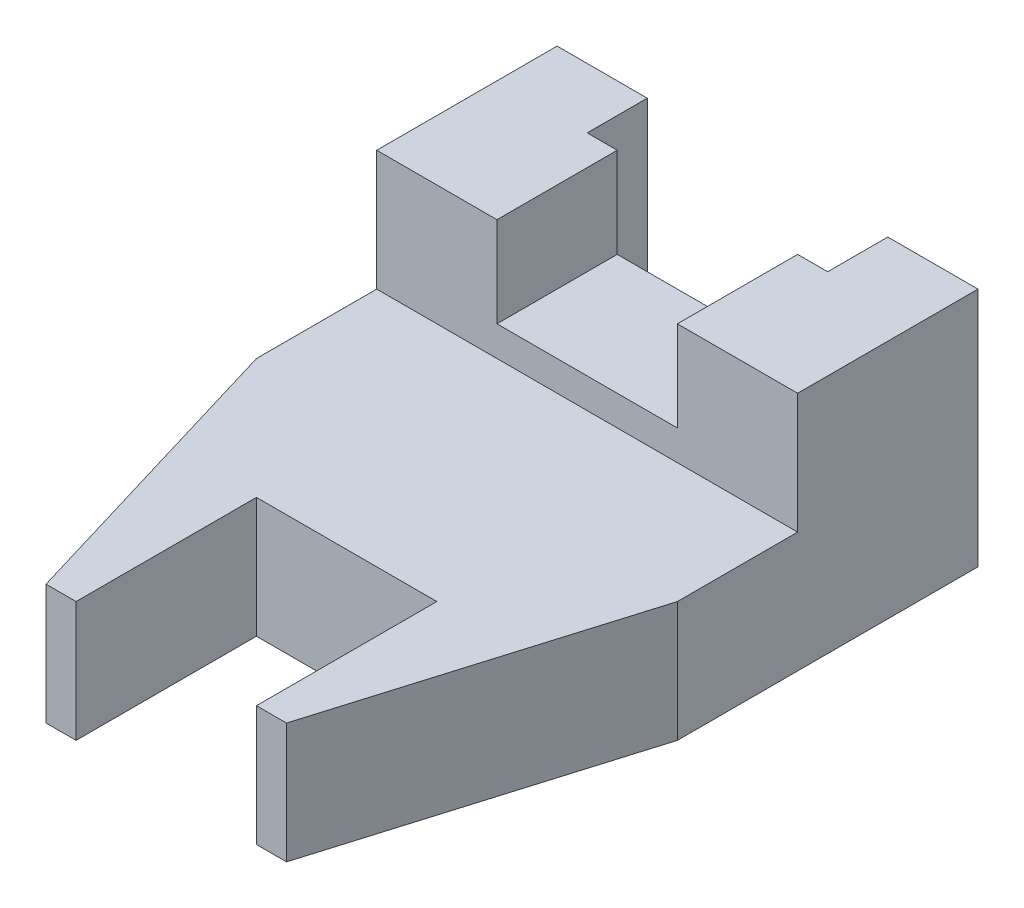
ISO-10303-21;
HEADER;
FILE_DESCRIPTION(('STEP AP214'),'2;1');
FILE_NAME('part.step','',(''),(''),'','','');
FILE_SCHEMA(('AUTOMOTIVE_DESIGN { 1 0 10303 214 1 1 1 1 }'));
ENDSEC;
DATA;
#1=APPLICATION_CONTEXT('core data for automotive mechanical design processes');
#2=APPLICATION_PROTOCOL_DEFINITION('international standard','automotive_design',2000,#1);
#3=PRODUCT_CONTEXT('',#1,'mechanical');
#4=PRODUCT('Part','Part','',(#3));
#5=PRODUCT_RELATED_PRODUCT_CATEGORY('part','',(#4));
#6=PRODUCT_DEFINITION_FORMATION('','',#4);
#7=PRODUCT_DEFINITION_CONTEXT('part definition',#1,'design');
#8=PRODUCT_DEFINITION('design','',#6,#7);
#9=PRODUCT_DEFINITION_SHAPE('','',#8);
#10=(LENGTH_UNIT() NAMED_UNIT(*) SI_UNIT(.MILLI.,.METRE.));
#11=(NAMED_UNIT(*) PLANE_ANGLE_UNIT() SI_UNIT($,.RADIAN.));
#12=(NAMED_UNIT(*) SI_UNIT($,.STERADIAN.) SOLID_ANGLE_UNIT());
#13=UNCERTAINTY_MEASURE_WITH_UNIT(LENGTH_MEASURE(1.E-05),#10,'distance_accuracy_value','');
#14=(GEOMETRIC_REPRESENTATION_CONTEXT(3) GLOBAL_UNCERTAINTY_ASSIGNED_CONTEXT((#13)) GLOBAL_UNIT_ASSIGNED_CONTEXT((#10,
#11,#12)) REPRESENTATION_CONTEXT('',''));
#15=CARTESIAN_POINT('',(0.,0.,0.));
#16=DIRECTION('',(0.,0.,1.));
#17=DIRECTION('',(1.,0.,0.));
#18=AXIS2_PLACEMENT_3D('',#15,#16,#17);
#19=CARTESIAN_POINT('',(0.,40.,0.));
#20=DIRECTION('',(0.,-1.,0.));
#21=DIRECTION('',(0.,0.,-1.));
#22=AXIS2_PLACEMENT_3D('',#19,#20,#21);
#23=PLANE('',#22);
#24=DIRECTION('',(1.,0.,0.));
#25=VECTOR('',#24,1.);
#26=CARTESIAN_POINT('',(15.,40.,-40.));
#27=LINE('',#26,#25);
#28=CARTESIAN_POINT('',(50.,40.,-40.));
#29=VERTEX_POINT('',#28);
#30=CARTESIAN_POINT('',(55.,40.,-40.));
#31=VERTEX_POINT('',#30);
#32=EDGE_CURVE('E198',#29,#31,#27,.T.);
#33=ORIENTED_EDGE('',*,*,#32,.F.);
#34=DIRECTION('',(0.,0.,1.));
#35=VECTOR('',#34,1.);
#36=CARTESIAN_POINT('',(50.,40.,-50.001));
#37=LINE('',#36,#35);
#38=CARTESIAN_POINT('',(50.,40.,-20.));
#39=VERTEX_POINT('',#38);
#40=EDGE_CURVE('E183',#29,#39,#37,.T.);
#41=ORIENTED_EDGE('',*,*,#40,.T.);
#42=DIRECTION('',(1.,0.,0.));
#43=VECTOR('',#42,1.);
#44=CARTESIAN_POINT('',(0.,40.,-20.));
#45=LINE('',#44,#43);
#46=CARTESIAN_POINT('',(70.,40.,-20.));
#47=VERTEX_POINT('',#46);
#48=EDGE_CURVE('E218',#39,#47,#45,.T.);
#49=ORIENTED_EDGE('',*,*,#48,.T.);
#50=DIRECTION('',(0.,0.,-1.));
#51=VECTOR('',#50,1.);
#52=CARTESIAN_POINT('',(70.,40.,-50.));
#53=LINE('',#52,#51);
#54=CARTESIAN_POINT('',(70.,40.,-50.));
#55=VERTEX_POINT('',#54);
#56=EDGE_CURVE('E220',#47,#55,#53,.T.);
#57=ORIENTED_EDGE('',*,*,#56,.T.);
#58=DIRECTION('',(-1.,0.,0.));
#59=VECTOR('',#58,1.);
#60=CARTESIAN_POINT('',(0.,40.,-50.));
#61=LINE('',#60,#59);
#62=CARTESIAN_POINT('',(55.,40.,-50.));
#63=VERTEX_POINT('',#62);
#64=EDGE_CURVE('E224',#55,#63,#61,.T.);
#65=ORIENTED_EDGE('',*,*,#64,.T.);
#66=DIRECTION('',(0.,0.,-1.));
#67=VECTOR('',#66,1.);
#68=CARTESIAN_POINT('',(55.,40.,-40.));
#69=LINE('',#68,#67);
#70=EDGE_CURVE('E197',#31,#63,#69,.T.);
#71=ORIENTED_EDGE('',*,*,#70,.F.);
#72=EDGE_LOOP('',(#33,#41,#49,#57,#65,#71));
#73=FACE_BOUND('',#72,.T.);
#74=ADVANCED_FACE('F37',(#73),#23,.F.);
#75=CARTESIAN_POINT('',(0.,20.,-50.));
#76=DIRECTION('',(0.,0.,1.));
#77=DIRECTION('',(1.,0.,0.));
#78=AXIS2_PLACEMENT_3D('',#75,#76,#77);
#79=PLANE('',#78);
#80=CARTESIAN_POINT('',(15.,40.,-50.));
#81=VERTEX_POINT('',#80);
#82=CARTESIAN_POINT('',(0.,40.,-50.));
#83=VERTEX_POINT('',#82);
#84=EDGE_CURVE('E223',#81,#83,#61,.T.);
#85=ORIENTED_EDGE('',*,*,#84,.F.);
#86=DIRECTION('',(0.,1.,0.));
#87=VECTOR('',#86,1.);
#88=CARTESIAN_POINT('',(15.,-0.001000000000001,-50.));
#89=LINE('',#88,#87);
#90=CARTESIAN_POINT('',(15.,0.,-50.));
#91=VERTEX_POINT('',#90);
#92=EDGE_CURVE('E204',#91,#81,#89,.T.);
#93=ORIENTED_EDGE('',*,*,#92,.F.);
#94=DIRECTION('',(-1.,0.,0.));
#95=VECTOR('',#94,1.);
#96=CARTESIAN_POINT('',(0.,0.,-50.));
#97=LINE('',#96,#95);
#98=CARTESIAN_POINT('',(0.,0.,-50.));
#99=VERTEX_POINT('',#98);
#100=EDGE_CURVE('E273',#91,#99,#97,.T.);
#101=ORIENTED_EDGE('',*,*,#100,.T.);
#102=DIRECTION('',(0.,-1.,0.));
#103=VECTOR('',#102,1.);
#104=CARTESIAN_POINT('',(0.,20.,-50.));
#105=LINE('',#104,#103);
#106=EDGE_CURVE('E280',#83,#99,#105,.T.);
#107=ORIENTED_EDGE('',*,*,#106,.F.);
#108=EDGE_LOOP('',(#85,#93,#101,#107));
#109=FACE_BOUND('',#108,.T.);
#110=ADVANCED_FACE('F342',(#109),#79,.F.);
#111=CARTESIAN_POINT('',(0.,20.,0.));
#112=DIRECTION('',(0.957826285221151,0.,-0.287347885566346));
#113=DIRECTION('',(-0.287347885566346,0.,-0.957826285221151));
#114=AXIS2_PLACEMENT_3D('',#111,#112,#113);
#115=PLANE('',#114);
#116=DIRECTION('',(0.287347885566346,0.,0.957826285221151));
#117=VECTOR('',#116,1.);
#118=CARTESIAN_POINT('',(0.,0.,0.));
#119=LINE('',#118,#117);
#120=CARTESIAN_POINT('',(0.,0.,0.));
#121=VERTEX_POINT('',#120);
#122=CARTESIAN_POINT('',(15.,0.,50.));
#123=VERTEX_POINT('',#122);
#124=EDGE_CURVE('E235',#121,#123,#119,.T.);
#125=ORIENTED_EDGE('',*,*,#124,.T.);
#126=DIRECTION('',(0.,-1.,0.));
#127=VECTOR('',#126,1.);
#128=CARTESIAN_POINT('',(15.,20.,50.));
#129=LINE('',#128,#127);
#130=CARTESIAN_POINT('',(15.,20.,50.));
#131=VERTEX_POINT('',#130);
#132=EDGE_CURVE('E11',#131,#123,#129,.T.);
#133=ORIENTED_EDGE('',*,*,#132,.F.);
#134=DIRECTION('',(0.287347885566346,0.,0.957826285221151));
#135=VECTOR('',#134,1.);
#136=CARTESIAN_POINT('',(0.,20.,0.));
#137=LINE('',#136,#135);
#138=CARTESIAN_POINT('',(0.,20.,0.));
#139=VERTEX_POINT('',#138);
#140=EDGE_CURVE('E236',#139,#131,#137,.T.);
#141=ORIENTED_EDGE('',*,*,#140,.F.);
#142=DIRECTION('',(0.,-1.,0.));
#143=VECTOR('',#142,1.);
#144=CARTESIAN_POINT('',(0.,20.,0.));
#145=LINE('',#144,#143);
#146=EDGE_CURVE('E256',#139,#121,#145,.T.);
#147=ORIENTED_EDGE('',*,*,#146,.T.);
#148=EDGE_LOOP('',(#125,#133,#141,#147));
#149=FACE_BOUND('',#148,.T.);
#150=ADVANCED_FACE('F39',(#149),#115,.F.);
#151=CARTESIAN_POINT('',(15.,20.,50.));
#152=DIRECTION('',(0.,0.,-1.));
#153=DIRECTION('',(-1.,0.,0.));
#154=AXIS2_PLACEMENT_3D('',#151,#152,#153);
#155=PLANE('',#154);
#156=DIRECTION('',(1.,0.,0.));
#157=VECTOR('',#156,1.);
#158=CARTESIAN_POINT('',(15.,0.,50.));
#159=LINE('',#158,#157);
#160=CARTESIAN_POINT('',(20.,0.,50.));
#161=VERTEX_POINT('',#160);
#162=EDGE_CURVE('E259',#123,#161,#159,.T.);
#163=ORIENTED_EDGE('',*,*,#162,.T.);
#164=DIRECTION('',(0.,-1.,0.));
#165=VECTOR('',#164,1.);
#166=CARTESIAN_POINT('',(20.,20.,50.));
#167=LINE('',#166,#165);
#168=CARTESIAN_POINT('',(20.,20.,50.));
#169=VERTEX_POINT('',#168);
#170=EDGE_CURVE('E45',#169,#161,#167,.T.);
#171=ORIENTED_EDGE('',*,*,#170,.F.);
#172=DIRECTION('',(1.,0.,0.));
#173=VECTOR('',#172,1.);
#174=CARTESIAN_POINT('',(15.,20.,50.));
#175=LINE('',#174,#173);
#176=EDGE_CURVE('E239',#131,#169,#175,.T.);
#177=ORIENTED_EDGE('',*,*,#176,.F.);
#178=ORIENTED_EDGE('',*,*,#132,.T.);
#179=EDGE_LOOP('',(#163,#171,#177,#178));
#180=FACE_BOUND('',#179,.T.);
#181=ADVANCED_FACE('F329',(#180),#155,.F.);
#182=CARTESIAN_POINT('',(20.,20.,50.));
#183=DIRECTION('',(-1.,0.,0.));
#184=DIRECTION('',(0.,0.,1.));
#185=AXIS2_PLACEMENT_3D('',#182,#183,#184);
#186=PLANE('',#185);
#187=DIRECTION('',(0.,0.,-1.));
#188=VECTOR('',#187,1.);
#189=CARTESIAN_POINT('',(20.,0.,50.));
#190=LINE('',#189,#188);
#191=CARTESIAN_POINT('',(20.,0.,20.));
#192=VERTEX_POINT('',#191);
#193=EDGE_CURVE('E261',#161,#192,#190,.T.);
#194=ORIENTED_EDGE('',*,*,#193,.T.);
#195=DIRECTION('',(0.,-1.,0.));
#196=VECTOR('',#195,1.);
#197=CARTESIAN_POINT('',(20.,20.,20.));
#198=LINE('',#197,#196);
#199=CARTESIAN_POINT('',(20.,20.,20.));
#200=VERTEX_POINT('',#199);
#201=EDGE_CURVE('E298',#200,#192,#198,.T.);
#202=ORIENTED_EDGE('',*,*,#201,.F.);
#203=DIRECTION('',(0.,0.,-1.));
#204=VECTOR('',#203,1.);
#205=CARTESIAN_POINT('',(20.,20.,50.));
#206=LINE('',#205,#204);
#207=EDGE_CURVE('E242',#169,#200,#206,.T.);
#208=ORIENTED_EDGE('',*,*,#207,.F.);
#209=ORIENTED_EDGE('',*,*,#170,.T.);
#210=EDGE_LOOP('',(#194,#202,#208,#209));
#211=FACE_BOUND('',#210,.T.);
#212=ADVANCED_FACE('F305',(#211),#186,.F.);
#213=CARTESIAN_POINT('',(20.,20.,20.));
#214=DIRECTION('',(0.,0.,-1.));
#215=DIRECTION('',(-1.,0.,0.));
#216=AXIS2_PLACEMENT_3D('',#213,#214,#215);
#217=PLANE('',#216);
#218=DIRECTION('',(1.,0.,0.));
#219=VECTOR('',#218,1.);
#220=CARTESIAN_POINT('',(20.,0.,20.));
#221=LINE('',#220,#219);
#222=CARTESIAN_POINT('',(50.,0.,20.));
#223=VERTEX_POINT('',#222);
#224=EDGE_CURVE('E263',#192,#223,#221,.T.);
#225=ORIENTED_EDGE('',*,*,#224,.T.);
#226=DIRECTION('',(0.,-1.,0.));
#227=VECTOR('',#226,1.);
#228=CARTESIAN_POINT('',(50.,20.,20.));
#229=LINE('',#228,#227);
#230=CARTESIAN_POINT('',(50.,20.,20.));
#231=VERTEX_POINT('',#230);
#232=EDGE_CURVE('E295',#231,#223,#229,.T.);
#233=ORIENTED_EDGE('',*,*,#232,.F.);
#234=DIRECTION('',(1.,0.,0.));
#235=VECTOR('',#234,1.);
#236=CARTESIAN_POINT('',(20.,20.,20.));
#237=LINE('',#236,#235);
#238=EDGE_CURVE('E244',#200,#231,#237,.T.);
#239=ORIENTED_EDGE('',*,*,#238,.F.);
#240=ORIENTED_EDGE('',*,*,#201,.T.);
#241=EDGE_LOOP('',(#225,#233,#239,#240));
#242=FACE_BOUND('',#241,.T.);
#243=ADVANCED_FACE('F317',(#242),#217,.F.);
#244=CARTESIAN_POINT('',(50.,20.,20.));
#245=DIRECTION('',(1.,0.,0.));
#246=DIRECTION('',(0.,0.,-1.));
#247=AXIS2_PLACEMENT_3D('',#244,#245,#246);
#248=PLANE('',#247);
#249=DIRECTION('',(0.,0.,1.));
#250=VECTOR('',#249,1.);
#251=CARTESIAN_POINT('',(50.,0.,20.));
#252=LINE('',#251,#250);
#253=CARTESIAN_POINT('',(50.,0.,50.));
#254=VERTEX_POINT('',#253);
#255=EDGE_CURVE('E265',#223,#254,#252,.T.);
#256=ORIENTED_EDGE('',*,*,#255,.T.);
#257=DIRECTION('',(0.,-1.,0.));
#258=VECTOR('',#257,1.);
#259=CARTESIAN_POINT('',(50.,20.,50.));
#260=LINE('',#259,#258);
#261=CARTESIAN_POINT('',(50.,20.,50.));
#262=VERTEX_POINT('',#261);
#263=EDGE_CURVE('E292',#262,#254,#260,.T.);
#264=ORIENTED_EDGE('',*,*,#263,.F.);
#265=DIRECTION('',(0.,0.,1.));
#266=VECTOR('',#265,1.);
#267=CARTESIAN_POINT('',(50.,20.,20.));
#268=LINE('',#267,#266);
#269=EDGE_CURVE('E246',#231,#262,#268,.T.);
#270=ORIENTED_EDGE('',*,*,#269,.F.);
#271=ORIENTED_EDGE('',*,*,#232,.T.);
#272=EDGE_LOOP('',(#256,#264,#270,#271));
#273=FACE_BOUND('',#272,.T.);
#274=ADVANCED_FACE('F321',(#273),#248,.F.);
#275=CARTESIAN_POINT('',(50.,20.,50.));
#276=DIRECTION('',(0.,0.,-1.));
#277=DIRECTION('',(-1.,0.,0.));
#278=AXIS2_PLACEMENT_3D('',#275,#276,#277);
#279=PLANE('',#278);
#280=DIRECTION('',(1.,0.,0.));
#281=VECTOR('',#280,1.);
#282=CARTESIAN_POINT('',(50.,0.,50.));
#283=LINE('',#282,#281);
#284=CARTESIAN_POINT('',(55.,0.,50.));
#285=VERTEX_POINT('',#284);
#286=EDGE_CURVE('E267',#254,#285,#283,.T.);
#287=ORIENTED_EDGE('',*,*,#286,.T.);
#288=DIRECTION('',(0.,-1.,0.));
#289=VECTOR('',#288,1.);
#290=CARTESIAN_POINT('',(55.,20.,50.));
#291=LINE('',#290,#289);
#292=CARTESIAN_POINT('',(55.,20.,50.));
#293=VERTEX_POINT('',#292);
#294=EDGE_CURVE('E289',#293,#285,#291,.T.);
#295=ORIENTED_EDGE('',*,*,#294,.F.);
#296=DIRECTION('',(1.,0.,0.));
#297=VECTOR('',#296,1.);
#298=CARTESIAN_POINT('',(50.,20.,50.));
#299=LINE('',#298,#297);
#300=EDGE_CURVE('E248',#262,#293,#299,.T.);
#301=ORIENTED_EDGE('',*,*,#300,.F.);
#302=ORIENTED_EDGE('',*,*,#263,.T.);
#303=EDGE_LOOP('',(#287,#295,#301,#302));
#304=FACE_BOUND('',#303,.T.);
#305=ADVANCED_FACE('F389',(#304),#279,.F.);
#306=CARTESIAN_POINT('',(55.,20.,50.));
#307=DIRECTION('',(-0.957826285221151,0.,-0.287347885566345));
#308=DIRECTION('',(-0.287347885566345,0.,0.957826285221151));
#309=AXIS2_PLACEMENT_3D('',#306,#307,#308);
#310=PLANE('',#309);
#311=DIRECTION('',(0.287347885566345,0.,-0.957826285221151));
#312=VECTOR('',#311,1.);
#313=CARTESIAN_POINT('',(55.,0.,50.));
#314=LINE('',#313,#312);
#315=CARTESIAN_POINT('',(70.,0.,0.));
#316=VERTEX_POINT('',#315);
#317=EDGE_CURVE('E269',#285,#316,#314,.T.);
#318=ORIENTED_EDGE('',*,*,#317,.T.);
#319=DIRECTION('',(0.,-1.,0.));
#320=VECTOR('',#319,1.);
#321=CARTESIAN_POINT('',(70.,20.,0.));
#322=LINE('',#321,#320);
#323=CARTESIAN_POINT('',(70.,20.,0.));
#324=VERTEX_POINT('',#323);
#325=EDGE_CURVE('E286',#324,#316,#322,.T.);
#326=ORIENTED_EDGE('',*,*,#325,.F.);
#327=DIRECTION('',(0.287347885566345,0.,-0.957826285221151));
#328=VECTOR('',#327,1.);
#329=CARTESIAN_POINT('',(55.,20.,50.));
#330=LINE('',#329,#328);
#331=EDGE_CURVE('E250',#293,#324,#330,.T.);
#332=ORIENTED_EDGE('',*,*,#331,.F.);
#333=ORIENTED_EDGE('',*,*,#294,.T.);
#334=EDGE_LOOP('',(#318,#326,#332,#333));
#335=FACE_BOUND('',#334,.T.);
#336=ADVANCED_FACE('F387',(#335),#310,.F.);
#337=CARTESIAN_POINT('',(70.,20.,0.));
#338=DIRECTION('',(-1.,0.,0.));
#339=DIRECTION('',(0.,0.,1.));
#340=AXIS2_PLACEMENT_3D('',#337,#338,#339);
#341=PLANE('',#340);
#342=DIRECTION('',(0.,0.,-1.));
#343=VECTOR('',#342,1.);
#344=CARTESIAN_POINT('',(70.,0.,0.));
#345=LINE('',#344,#343);
#346=CARTESIAN_POINT('',(70.,0.,-50.));
#347=VERTEX_POINT('',#346);
#348=EDGE_CURVE('E271',#316,#347,#345,.T.);
#349=ORIENTED_EDGE('',*,*,#348,.T.);
#350=DIRECTION('',(0.,-1.,0.));
#351=VECTOR('',#350,1.);
#352=CARTESIAN_POINT('',(70.,20.,-50.));
#353=LINE('',#352,#351);
#354=EDGE_CURVE('E283',#55,#347,#353,.T.);
#355=ORIENTED_EDGE('',*,*,#354,.F.);
#356=ORIENTED_EDGE('',*,*,#56,.F.);
#357=DIRECTION('',(0.,-1.,0.));
#358=VECTOR('',#357,1.);
#359=CARTESIAN_POINT('',(70.,40.,-20.));
#360=LINE('',#359,#358);
#361=CARTESIAN_POINT('',(70.,20.,-20.));
#362=VERTEX_POINT('',#361);
#363=EDGE_CURVE('E227',#47,#362,#360,.T.);
#364=ORIENTED_EDGE('',*,*,#363,.T.);
#365=DIRECTION('',(0.,0.,-1.));
#366=VECTOR('',#365,1.);
#367=CARTESIAN_POINT('',(70.,20.,0.));
#368=LINE('',#367,#366);
#369=EDGE_CURVE('E252',#324,#362,#368,.T.);
#370=ORIENTED_EDGE('',*,*,#369,.F.);
#371=ORIENTED_EDGE('',*,*,#325,.T.);
#372=EDGE_LOOP('',(#349,#355,#356,#364,#370,#371));
#373=FACE_BOUND('',#372,.T.);
#374=ADVANCED_FACE('F381',(#373),#341,.F.);
#375=CARTESIAN_POINT('',(55.,0.,-50.));
#376=VERTEX_POINT('',#375);
#377=EDGE_CURVE('E274',#347,#376,#97,.T.);
#378=ORIENTED_EDGE('',*,*,#377,.T.);
#379=DIRECTION('',(0.,1.,0.));
#380=VECTOR('',#379,1.);
#381=CARTESIAN_POINT('',(55.,-0.001000000000001,-50.));
#382=LINE('',#381,#380);
#383=EDGE_CURVE('E207',#376,#63,#382,.T.);
#384=ORIENTED_EDGE('',*,*,#383,.T.);
#385=ORIENTED_EDGE('',*,*,#64,.F.);
#386=ORIENTED_EDGE('',*,*,#354,.T.);
#387=EDGE_LOOP('',(#378,#384,#385,#386));
#388=FACE_BOUND('',#387,.T.);
#389=ADVANCED_FACE('F375',(#388),#79,.F.);
#390=CARTESIAN_POINT('',(0.,20.,0.));
#391=DIRECTION('',(1.,0.,0.));
#392=DIRECTION('',(0.,0.,-1.));
#393=AXIS2_PLACEMENT_3D('',#390,#391,#392);
#394=PLANE('',#393);
#395=DIRECTION('',(0.,0.,1.));
#396=VECTOR('',#395,1.);
#397=CARTESIAN_POINT('',(0.,0.,0.));
#398=LINE('',#397,#396);
#399=EDGE_CURVE('E240',#99,#121,#398,.T.);
#400=ORIENTED_EDGE('',*,*,#399,.T.);
#401=ORIENTED_EDGE('',*,*,#146,.F.);
#402=DIRECTION('',(0.,0.,1.));
#403=VECTOR('',#402,1.);
#404=CARTESIAN_POINT('',(0.,20.,0.));
#405=LINE('',#404,#403);
#406=CARTESIAN_POINT('',(0.,20.,-20.));
#407=VERTEX_POINT('',#406);
#408=EDGE_CURVE('E254',#407,#139,#405,.T.);
#409=ORIENTED_EDGE('',*,*,#408,.F.);
#410=DIRECTION('',(0.,-1.,0.));
#411=VECTOR('',#410,1.);
#412=CARTESIAN_POINT('',(0.,40.,-20.));
#413=LINE('',#412,#411);
#414=CARTESIAN_POINT('',(0.,40.,-20.));
#415=VERTEX_POINT('',#414);
#416=EDGE_CURVE('E232',#415,#407,#413,.T.);
#417=ORIENTED_EDGE('',*,*,#416,.F.);
#418=DIRECTION('',(0.,0.,1.));
#419=VECTOR('',#418,1.);
#420=CARTESIAN_POINT('',(0.,40.,-20.));
#421=LINE('',#420,#419);
#422=EDGE_CURVE('E216',#83,#415,#421,.T.);
#423=ORIENTED_EDGE('',*,*,#422,.F.);
#424=ORIENTED_EDGE('',*,*,#106,.T.);
#425=EDGE_LOOP('',(#400,#401,#409,#417,#423,#424));
#426=FACE_BOUND('',#425,.T.);
#427=ADVANCED_FACE('F335',(#426),#394,.F.);
#428=CARTESIAN_POINT('',(0.,20.,0.));
#429=DIRECTION('',(0.,1.,0.));
#430=DIRECTION('',(0.,0.,1.));
#431=AXIS2_PLACEMENT_3D('',#428,#429,#430);
#432=PLANE('',#431);
#433=DIRECTION('',(1.,0.,0.));
#434=VECTOR('',#433,1.);
#435=CARTESIAN_POINT('',(0.,20.,-20.));
#436=LINE('',#435,#434);
#437=EDGE_CURVE('E215',#407,#362,#436,.T.);
#438=ORIENTED_EDGE('',*,*,#437,.F.);
#439=ORIENTED_EDGE('',*,*,#408,.T.);
#440=ORIENTED_EDGE('',*,*,#140,.T.);
#441=ORIENTED_EDGE('',*,*,#176,.T.);
#442=ORIENTED_EDGE('',*,*,#207,.T.);
#443=ORIENTED_EDGE('',*,*,#238,.T.);
#444=ORIENTED_EDGE('',*,*,#269,.T.);
#445=ORIENTED_EDGE('',*,*,#300,.T.);
#446=ORIENTED_EDGE('',*,*,#331,.T.);
#447=ORIENTED_EDGE('',*,*,#369,.T.);
#448=EDGE_LOOP('',(#438,#439,#440,#441,#442,#443,#444,#445,#446,#447));
#449=FACE_BOUND('',#448,.T.);
#450=ADVANCED_FACE('F325',(#449),#432,.T.);
#451=CARTESIAN_POINT('',(0.,0.,0.));
#452=DIRECTION('',(0.,1.,0.));
#453=DIRECTION('',(0.,0.,1.));
#454=AXIS2_PLACEMENT_3D('',#451,#452,#453);
#455=PLANE('',#454);
#456=ORIENTED_EDGE('',*,*,#100,.F.);
#457=DIRECTION('',(0.,0.,-1.));
#458=VECTOR('',#457,1.);
#459=CARTESIAN_POINT('',(15.,0.,-40.));
#460=LINE('',#459,#458);
#461=CARTESIAN_POINT('',(15.,0.,-40.));
#462=VERTEX_POINT('',#461);
#463=EDGE_CURVE('E345',#462,#91,#460,.T.);
#464=ORIENTED_EDGE('',*,*,#463,.F.);
#465=DIRECTION('',(-1.,0.,0.));
#466=VECTOR('',#465,1.);
#467=CARTESIAN_POINT('',(15.,0.,-40.));
#468=LINE('',#467,#466);
#469=CARTESIAN_POINT('',(55.,0.,-40.));
#470=VERTEX_POINT('',#469);
#471=EDGE_CURVE('E206',#470,#462,#468,.T.);
#472=ORIENTED_EDGE('',*,*,#471,.F.);
#473=DIRECTION('',(0.,0.,1.));
#474=VECTOR('',#473,1.);
#475=CARTESIAN_POINT('',(55.,0.,-40.));
#476=LINE('',#475,#474);
#477=EDGE_CURVE('E182',#376,#470,#476,.T.);
#478=ORIENTED_EDGE('',*,*,#477,.F.);
#479=ORIENTED_EDGE('',*,*,#377,.F.);
#480=ORIENTED_EDGE('',*,*,#348,.F.);
#481=ORIENTED_EDGE('',*,*,#317,.F.);
#482=ORIENTED_EDGE('',*,*,#286,.F.);
#483=ORIENTED_EDGE('',*,*,#255,.F.);
#484=ORIENTED_EDGE('',*,*,#224,.F.);
#485=ORIENTED_EDGE('',*,*,#193,.F.);
#486=ORIENTED_EDGE('',*,*,#162,.F.);
#487=ORIENTED_EDGE('',*,*,#124,.F.);
#488=ORIENTED_EDGE('',*,*,#399,.F.);
#489=EDGE_LOOP('',(#456,#464,#472,#478,#479,#480,#481,#482,#483,#484,#485,#486,#487,#488));
#490=FACE_BOUND('',#489,.T.);
#491=ADVANCED_FACE('F311',(#490),#455,.F.);
#492=CARTESIAN_POINT('',(0.,40.,-20.));
#493=DIRECTION('',(0.,0.,-1.));
#494=DIRECTION('',(-1.,0.,0.));
#495=AXIS2_PLACEMENT_3D('',#492,#493,#494);
#496=PLANE('',#495);
#497=ORIENTED_EDGE('',*,*,#48,.F.);
#498=DIRECTION('',(0.,1.,0.));
#499=VECTOR('',#498,1.);
#500=CARTESIAN_POINT('',(50.,25.,-20.));
#501=LINE('',#500,#499);
#502=CARTESIAN_POINT('',(50.,25.,-20.));
#503=VERTEX_POINT('',#502);
#504=EDGE_CURVE('E192',#503,#39,#501,.T.);
#505=ORIENTED_EDGE('',*,*,#504,.F.);
#506=DIRECTION('',(1.,0.,0.));
#507=VECTOR('',#506,1.);
#508=CARTESIAN_POINT('',(20.,25.,-20.));
#509=LINE('',#508,#507);
#510=CARTESIAN_POINT('',(20.,25.,-20.));
#511=VERTEX_POINT('',#510);
#512=EDGE_CURVE('E355',#511,#503,#509,.T.);
#513=ORIENTED_EDGE('',*,*,#512,.F.);
#514=DIRECTION('',(0.,-1.,0.));
#515=VECTOR('',#514,1.);
#516=CARTESIAN_POINT('',(20.,40.,-20.));
#517=LINE('',#516,#515);
#518=CARTESIAN_POINT('',(20.,40.,-20.));
#519=VERTEX_POINT('',#518);
#520=EDGE_CURVE('E358',#519,#511,#517,.T.);
#521=ORIENTED_EDGE('',*,*,#520,.F.);
#522=EDGE_CURVE('E191',#415,#519,#45,.T.);
#523=ORIENTED_EDGE('',*,*,#522,.F.);
#524=ORIENTED_EDGE('',*,*,#416,.T.);
#525=ORIENTED_EDGE('',*,*,#437,.T.);
#526=ORIENTED_EDGE('',*,*,#363,.F.);
#527=EDGE_LOOP('',(#497,#505,#513,#521,#523,#524,#525,#526));
#528=FACE_BOUND('',#527,.T.);
#529=ADVANCED_FACE('F407',(#528),#496,.F.);
#530=ORIENTED_EDGE('',*,*,#522,.T.);
#531=DIRECTION('',(0.,0.,1.));
#532=VECTOR('',#531,1.);
#533=CARTESIAN_POINT('',(20.,40.,-50.001));
#534=LINE('',#533,#532);
#535=CARTESIAN_POINT('',(20.,40.,-40.));
#536=VERTEX_POINT('',#535);
#537=EDGE_CURVE('E177',#536,#519,#534,.T.);
#538=ORIENTED_EDGE('',*,*,#537,.F.);
#539=CARTESIAN_POINT('',(15.,40.,-40.));
#540=VERTEX_POINT('',#539);
#541=EDGE_CURVE('E189',#540,#536,#27,.T.);
#542=ORIENTED_EDGE('',*,*,#541,.F.);
#543=DIRECTION('',(0.,0.,1.));
#544=VECTOR('',#543,1.);
#545=CARTESIAN_POINT('',(15.,40.,-40.));
#546=LINE('',#545,#544);
#547=EDGE_CURVE('E60',#81,#540,#546,.T.);
#548=ORIENTED_EDGE('',*,*,#547,.F.);
#549=ORIENTED_EDGE('',*,*,#84,.T.);
#550=ORIENTED_EDGE('',*,*,#422,.T.);
#551=EDGE_LOOP('',(#530,#538,#542,#548,#549,#550));
#552=FACE_BOUND('',#551,.T.);
#553=ADVANCED_FACE('F188',(#552),#23,.F.);
#554=CARTESIAN_POINT('',(15.,-0.001000000000001,-40.));
#555=DIRECTION('',(-1.,0.,0.));
#556=DIRECTION('',(0.,0.,1.));
#557=AXIS2_PLACEMENT_3D('',#554,#555,#556);
#558=PLANE('',#557);
#559=ORIENTED_EDGE('',*,*,#463,.T.);
#560=ORIENTED_EDGE('',*,*,#92,.T.);
#561=ORIENTED_EDGE('',*,*,#547,.T.);
#562=DIRECTION('',(0.,1.,0.));
#563=VECTOR('',#562,1.);
#564=CARTESIAN_POINT('',(15.,-0.001000000000001,-40.));
#565=LINE('',#564,#563);
#566=EDGE_CURVE('E196',#462,#540,#565,.T.);
#567=ORIENTED_EDGE('',*,*,#566,.F.);
#568=EDGE_LOOP('',(#559,#560,#561,#567));
#569=FACE_BOUND('',#568,.T.);
#570=ADVANCED_FACE('F344',(#569),#558,.F.);
#571=CARTESIAN_POINT('',(55.,-0.001000000000001,-40.));
#572=DIRECTION('',(1.,0.,0.));
#573=DIRECTION('',(0.,0.,-1.));
#574=AXIS2_PLACEMENT_3D('',#571,#572,#573);
#575=PLANE('',#574);
#576=ORIENTED_EDGE('',*,*,#477,.T.);
#577=DIRECTION('',(0.,1.,0.));
#578=VECTOR('',#577,1.);
#579=CARTESIAN_POINT('',(55.,-0.001000000000001,-40.));
#580=LINE('',#579,#578);
#581=EDGE_CURVE('E210',#470,#31,#580,.T.);
#582=ORIENTED_EDGE('',*,*,#581,.T.);
#583=ORIENTED_EDGE('',*,*,#70,.T.);
#584=ORIENTED_EDGE('',*,*,#383,.F.);
#585=EDGE_LOOP('',(#576,#582,#583,#584));
#586=FACE_BOUND('',#585,.T.);
#587=ADVANCED_FACE('F372',(#586),#575,.F.);
#588=CARTESIAN_POINT('',(15.,-0.001000000000001,-40.));
#589=DIRECTION('',(0.,0.,1.));
#590=DIRECTION('',(1.,0.,0.));
#591=AXIS2_PLACEMENT_3D('',#588,#589,#590);
#592=PLANE('',#591);
#593=DIRECTION('',(-1.,0.,0.));
#594=VECTOR('',#593,1.);
#595=CARTESIAN_POINT('',(20.,25.,-40.));
#596=LINE('',#595,#594);
#597=CARTESIAN_POINT('',(50.,25.,-40.));
#598=VERTEX_POINT('',#597);
#599=CARTESIAN_POINT('',(20.,25.,-40.));
#600=VERTEX_POINT('',#599);
#601=EDGE_CURVE('E52',#598,#600,#596,.T.);
#602=ORIENTED_EDGE('',*,*,#601,.F.);
#603=DIRECTION('',(0.,-1.,0.));
#604=VECTOR('',#603,1.);
#605=CARTESIAN_POINT('',(50.,25.,-40.));
#606=LINE('',#605,#604);
#607=EDGE_CURVE('E360',#29,#598,#606,.T.);
#608=ORIENTED_EDGE('',*,*,#607,.F.);
#609=ORIENTED_EDGE('',*,*,#32,.T.);
#610=ORIENTED_EDGE('',*,*,#581,.F.);
#611=ORIENTED_EDGE('',*,*,#471,.T.);
#612=ORIENTED_EDGE('',*,*,#566,.T.);
#613=ORIENTED_EDGE('',*,*,#541,.T.);
#614=DIRECTION('',(0.,1.,0.));
#615=VECTOR('',#614,1.);
#616=CARTESIAN_POINT('',(20.,40.,-40.));
#617=LINE('',#616,#615);
#618=EDGE_CURVE('E173',#600,#536,#617,.T.);
#619=ORIENTED_EDGE('',*,*,#618,.F.);
#620=EDGE_LOOP('',(#602,#608,#609,#610,#611,#612,#613,#619));
#621=FACE_BOUND('',#620,.T.);
#622=ADVANCED_FACE('F194',(#621),#592,.F.);
#623=CARTESIAN_POINT('',(50.,25.,-50.001));
#624=DIRECTION('',(1.,0.,0.));
#625=DIRECTION('',(0.,0.,-1.));
#626=AXIS2_PLACEMENT_3D('',#623,#624,#625);
#627=PLANE('',#626);
#628=ORIENTED_EDGE('',*,*,#607,.T.);
#629=DIRECTION('',(0.,0.,1.));
#630=VECTOR('',#629,1.);
#631=CARTESIAN_POINT('',(50.,25.,-50.001));
#632=LINE('',#631,#630);
#633=EDGE_CURVE('E350',#598,#503,#632,.T.);
#634=ORIENTED_EDGE('',*,*,#633,.T.);
#635=ORIENTED_EDGE('',*,*,#504,.T.);
#636=ORIENTED_EDGE('',*,*,#40,.F.);
#637=EDGE_LOOP('',(#628,#634,#635,#636));
#638=FACE_BOUND('',#637,.T.);
#639=ADVANCED_FACE('F365',(#638),#627,.F.);
#640=CARTESIAN_POINT('',(20.,25.,-50.001));
#641=DIRECTION('',(0.,-1.,0.));
#642=DIRECTION('',(0.,0.,-1.));
#643=AXIS2_PLACEMENT_3D('',#640,#641,#642);
#644=PLANE('',#643);
#645=ORIENTED_EDGE('',*,*,#601,.T.);
#646=DIRECTION('',(0.,0.,1.));
#647=VECTOR('',#646,1.);
#648=CARTESIAN_POINT('',(20.,25.,-50.001));
#649=LINE('',#648,#647);
#650=EDGE_CURVE('E179',#600,#511,#649,.T.);
#651=ORIENTED_EDGE('',*,*,#650,.T.);
#652=ORIENTED_EDGE('',*,*,#512,.T.);
#653=ORIENTED_EDGE('',*,*,#633,.F.);
#654=EDGE_LOOP('',(#645,#651,#652,#653));
#655=FACE_BOUND('',#654,.T.);
#656=ADVANCED_FACE('F497',(#655),#644,.F.);
#657=CARTESIAN_POINT('',(20.,40.,-50.001));
#658=DIRECTION('',(-1.,0.,0.));
#659=DIRECTION('',(0.,0.,1.));
#660=AXIS2_PLACEMENT_3D('',#657,#658,#659);
#661=PLANE('',#660);
#662=ORIENTED_EDGE('',*,*,#618,.T.);
#663=ORIENTED_EDGE('',*,*,#537,.T.);
#664=ORIENTED_EDGE('',*,*,#520,.T.);
#665=ORIENTED_EDGE('',*,*,#650,.F.);
#666=EDGE_LOOP('',(#662,#663,#664,#665));
#667=FACE_BOUND('',#666,.T.);
#668=ADVANCED_FACE('F175',(#667),#661,.F.);
#669=CLOSED_SHELL('',(#74,#110,#150,#181,#212,#243,#274,#305,#336,#374,#389,#427,#450,#491,#529,
#553,#570,#587,#622,#639,#656,#668));
#670=MANIFOLD_SOLID_BREP('B2',#669);
#671=ADVANCED_BREP_SHAPE_REPRESENTATION('',(#18,#670),#14);
#672=SHAPE_DEFINITION_REPRESENTATION(#9,#671);
ENDSEC;
END-ISO-10303-21;
